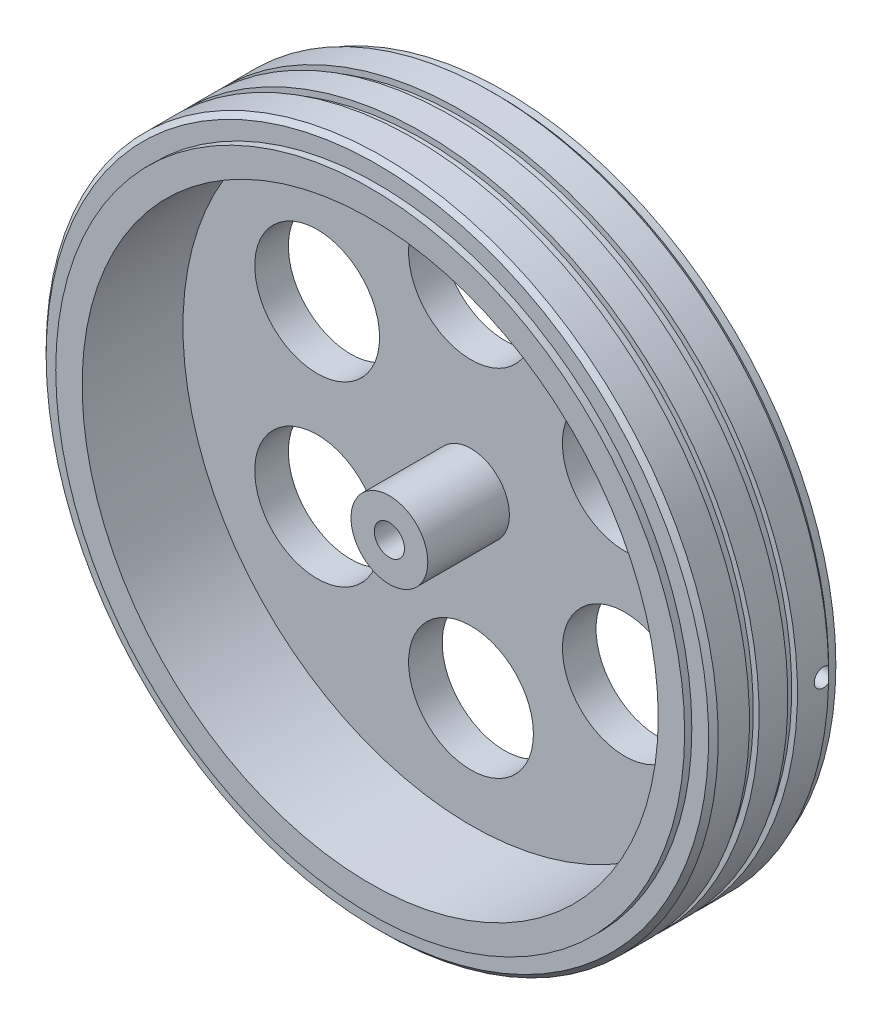
ISO-10303-21;
HEADER;
FILE_DESCRIPTION(('STEP AP214'),'2;1');
FILE_NAME('part.step','',(''),(''),'','','');
FILE_SCHEMA(('AUTOMOTIVE_DESIGN { 1 0 10303 214 1 1 1 1 }'));
ENDSEC;
DATA;
#1=APPLICATION_CONTEXT('core data for automotive mechanical design processes');
#2=APPLICATION_PROTOCOL_DEFINITION('international standard','automotive_design',2000,#1);
#3=PRODUCT_CONTEXT('',#1,'mechanical');
#4=PRODUCT('Part','Part','',(#3));
#5=PRODUCT_RELATED_PRODUCT_CATEGORY('part','',(#4));
#6=PRODUCT_DEFINITION_FORMATION('','',#4);
#7=PRODUCT_DEFINITION_CONTEXT('part definition',#1,'design');
#8=PRODUCT_DEFINITION('design','',#6,#7);
#9=PRODUCT_DEFINITION_SHAPE('','',#8);
#10=(LENGTH_UNIT() NAMED_UNIT(*) SI_UNIT(.MILLI.,.METRE.));
#11=(NAMED_UNIT(*) PLANE_ANGLE_UNIT() SI_UNIT($,.RADIAN.));
#12=(NAMED_UNIT(*) SI_UNIT($,.STERADIAN.) SOLID_ANGLE_UNIT());
#13=UNCERTAINTY_MEASURE_WITH_UNIT(LENGTH_MEASURE(1.E-05),#10,'distance_accuracy_value','');
#14=(GEOMETRIC_REPRESENTATION_CONTEXT(3) GLOBAL_UNCERTAINTY_ASSIGNED_CONTEXT((#13)) GLOBAL_UNIT_ASSIGNED_CONTEXT((#10,
#11,#12)) REPRESENTATION_CONTEXT('',''));
#15=CARTESIAN_POINT('',(0.,0.,0.));
#16=DIRECTION('',(0.,0.,1.));
#17=DIRECTION('',(1.,0.,0.));
#18=AXIS2_PLACEMENT_3D('',#15,#16,#17);
#19=CARTESIAN_POINT('',(0.,0.,0.));
#20=DIRECTION('',(0.,0.,-1.));
#21=DIRECTION('',(-1.,0.,0.));
#22=AXIS2_PLACEMENT_3D('',#19,#20,#21);
#23=CYLINDRICAL_SURFACE('',#22,70.);
#24=CARTESIAN_POINT('',(0.,0.,9.));
#25=DIRECTION('',(0.,0.,-1.));
#26=DIRECTION('',(-1.,0.,0.));
#27=AXIS2_PLACEMENT_3D('',#24,#25,#26);
#28=CIRCLE('',#27,70.);
#29=CARTESIAN_POINT('',(-70.,0.,9.));
#30=VERTEX_POINT('',#29);
#31=EDGE_CURVE('E72',#30,#30,#28,.T.);
#32=ORIENTED_EDGE('',*,*,#31,.T.);
#33=EDGE_LOOP('',(#32));
#34=FACE_BOUND('',#33,.T.);
#35=CARTESIAN_POINT('',(0.,0.,2.5));
#36=DIRECTION('',(0.,0.,-1.));
#37=DIRECTION('',(-1.,0.,0.));
#38=AXIS2_PLACEMENT_3D('',#35,#36,#37);
#39=CIRCLE('',#38,70.);
#40=CARTESIAN_POINT('',(69.9828550432176,-1.54919333848297,2.5));
#41=VERTEX_POINT('',#40);
#42=CARTESIAN_POINT('',(69.9828550432176,1.54919333848316,2.50000000000005));
#43=VERTEX_POINT('',#42);
#44=EDGE_CURVE('E67',#41,#43,#39,.T.);
#45=ORIENTED_EDGE('',*,*,#44,.F.);
#46=CARTESIAN_POINT('',(69.9828550432176,-1.54919333848297,2.5));
#47=CARTESIAN_POINT('',(69.9821699950699,-1.5801340021469,2.54357614975485));
#48=CARTESIAN_POINT('',(69.9815057230291,-1.60922088594838,2.58843752146515));
#49=CARTESIAN_POINT('',(69.9802362062229,-1.66351438197364,2.68044780927643));
#50=CARTESIAN_POINT('',(69.9796309587392,-1.6887211729357,2.72759661987382));
#51=CARTESIAN_POINT('',(69.9779316695055,-1.75819283756116,2.87190332629973));
#52=CARTESIAN_POINT('',(69.9769517970483,-1.79640824288858,2.97206155341133));
#53=CARTESIAN_POINT('',(69.9754104239647,-1.85548287890554,3.177371336838));
#54=CARTESIAN_POINT('',(69.9748491216351,-1.87633388378002,3.28252523478481));
#55=CARTESIAN_POINT('',(69.974208127022,-1.90008974999773,3.49483479849327));
#56=CARTESIAN_POINT('',(69.9741283376153,-1.90299823042355,3.60199005619832));
#57=CARTESIAN_POINT('',(69.9744593309165,-1.89078742296584,3.81524349461538));
#58=CARTESIAN_POINT('',(69.9748700195424,-1.87567159245446,3.92134187411889));
#59=CARTESIAN_POINT('',(69.9761355208292,-1.82784676701289,4.12951167444869));
#60=CARTESIAN_POINT('',(69.9769904017315,-1.79513506880407,4.23158247392508));
#61=CARTESIAN_POINT('',(69.9790479473008,-1.71304532050085,4.42878404038143));
#62=CARTESIAN_POINT('',(69.980250617261,-1.66366701675153,4.52391470171018));
#63=CARTESIAN_POINT('',(69.9828680766323,-1.54964988274148,4.70453162577262));
#64=CARTESIAN_POINT('',(69.9842828531443,-1.48501198033212,4.79001847442605));
#65=CARTESIAN_POINT('',(69.9871656976668,-1.34228188104707,4.94895955281252));
#66=CARTESIAN_POINT('',(69.9886337841544,-1.26418498348774,5.02240956101865));
#67=CARTESIAN_POINT('',(69.9914573418898,-1.09676574665419,5.15515851542349));
#68=CARTESIAN_POINT('',(69.9928128107317,-1.0074431676667,5.21445715935547));
#69=CARTESIAN_POINT('',(69.9952584140288,-0.820100202444896,5.31722188137198));
#70=CARTESIAN_POINT('',(69.9963485281451,-0.72207915027324,5.36068674595205));
#71=CARTESIAN_POINT('',(69.9981403678773,-0.520128056057234,5.43054163115542));
#72=CARTESIAN_POINT('',(69.998842096478,-0.416198059431255,5.4569317830021));
#73=CARTESIAN_POINT('',(69.9997779050191,-0.205410885079069,5.49188167208642));
#74=CARTESIAN_POINT('',(70.0000121199809,-0.0985545615381522,5.50044655742378));
#75=CARTESIAN_POINT('',(69.9999869047689,0.115079392891074,5.49951751213647));
#76=CARTESIAN_POINT('',(69.9997274752964,0.221857023890941,5.49002360716173));
#77=CARTESIAN_POINT('',(69.9987443254946,0.43227862075402,5.45325123699736));
#78=CARTESIAN_POINT('',(69.9980207050109,0.535923255492567,5.42597659634831));
#79=CARTESIAN_POINT('',(69.996190788202,0.737162914267488,5.3544216502671));
#80=CARTESIAN_POINT('',(69.9950844892186,0.834757896275256,5.31014122670646));
#81=CARTESIAN_POINT('',(69.9926135697291,1.02114947267244,5.20582135426022));
#82=CARTESIAN_POINT('',(69.9912488961611,1.10994425406724,5.14577866733212));
#83=CARTESIAN_POINT('',(69.9884151488781,1.27619359691991,5.0116435473827));
#84=CARTESIAN_POINT('',(69.9869460770559,1.35364836390028,4.93755136904536));
#85=CARTESIAN_POINT('',(69.9840686144789,1.49504365705181,4.77739470803601));
#86=CARTESIAN_POINT('',(69.9826602408072,1.55898039817505,4.69132688333819));
#87=CARTESIAN_POINT('',(69.9800633354694,1.67150085522027,4.50967058580225));
#88=CARTESIAN_POINT('',(69.978874816893,1.7200836571235,4.41408154661232));
#89=CARTESIAN_POINT('',(69.9768518452718,1.80050925670676,4.21610219511737));
#90=CARTESIAN_POINT('',(69.976017382932,1.83235249385168,4.11371206144143));
#91=CARTESIAN_POINT('',(69.9747967411601,1.87839217589012,3.90505163831947));
#92=CARTESIAN_POINT('',(69.9744104976447,1.89259114346007,3.79878190579321));
#93=CARTESIAN_POINT('',(69.9741297695507,1.90294268993806,3.58539985792459));
#94=CARTESIAN_POINT('',(69.974235119634,1.89910133635394,3.47828783796744));
#95=CARTESIAN_POINT('',(69.9749251900655,1.87350106196241,3.26622215540905));
#96=CARTESIAN_POINT('',(69.975509984633,1.85173936703058,3.16126882955886));
#97=CARTESIAN_POINT('',(69.9770732557186,1.79167187537866,2.95911883798243));
#98=CARTESIAN_POINT('',(69.9780411672215,1.75380818380465,2.86179180816243));
#99=CARTESIAN_POINT('',(69.9797083198211,1.68550734717637,2.72148731200217));
#100=CARTESIAN_POINT('',(69.9803003723284,1.66080308424496,2.67563892804158));
#101=CARTESIAN_POINT('',(69.9815400634534,1.60771673856627,2.58612007363377));
#102=CARTESIAN_POINT('',(69.9821877055623,1.57933442476797,2.54244974024811));
#103=CARTESIAN_POINT('',(69.9828550432176,1.54919333848297,2.5));
#104=B_SPLINE_CURVE_WITH_KNOTS('',3,(#46,#47,#48,#49,#50,#51,#52,#53,#54,#55,#56,#57,#58,#59,
#60,#61,#62,#63,#64,#65,#66,#67,#68,#69,#70,#71,#72,#73,#74,#75,#76,#77,#78,#79,#80,#81,#82,#83,
#84,#85,#86,#87,#88,#89,#90,#91,#92,#93,#94,#95,#96,#97,#98,#99,#100,#101,#102,#103),
.UNSPECIFIED.,.F.,.F.,(4,2,2,2,2,2,2,2,2,2,2,2,2,2,2,2,2,2,2,2,2,2,2,2,2,2,2,2,4),(0.,
0.160245183234278,0.320482982489432,0.640450132563806,0.960568770496787,1.2806228370434,
1.60061552160209,1.92065738114699,2.24070411174083,2.5607313870821,2.8808706623929,
3.20101677512147,3.52118741876195,3.84135560178301,4.16143130447087,4.48150655253749,
4.80151297684569,5.12152162407768,5.44159606221454,5.76166469871489,6.08182283611079,
6.40200002890597,6.72216881564835,7.0422918212256,7.36230716742662,7.68237206231039,
7.99416511898878,8.15026430628806,8.30637330431985),.UNSPECIFIED.);
#105=EDGE_CURVE('E56',#41,#43,#104,.T.);
#106=ORIENTED_EDGE('',*,*,#105,.T.);
#107=EDGE_LOOP('',(#45,#106));
#108=FACE_BOUND('',#107,.T.);
#109=ADVANCED_FACE('F39',(#34,#108),#23,.T.);
#110=CARTESIAN_POINT('',(0.,0.,1.5));
#111=DIRECTION('',(0.,0.,1.));
#112=DIRECTION('',(1.,0.,0.));
#113=AXIS2_PLACEMENT_3D('',#110,#111,#112);
#114=CONICAL_SURFACE('',#113,69.,0.785398163397449);
#115=CARTESIAN_POINT('',(0.,0.,1.5));
#116=DIRECTION('',(0.,0.,-1.));
#117=DIRECTION('',(-1.,0.,0.));
#118=AXIS2_PLACEMENT_3D('',#115,#116,#117);
#119=CIRCLE('',#118,69.);
#120=CARTESIAN_POINT('',(-69.,0.,1.5));
#121=VERTEX_POINT('',#120);
#122=EDGE_CURVE('E75',#121,#121,#119,.T.);
#123=ORIENTED_EDGE('',*,*,#122,.F.);
#124=EDGE_LOOP('',(#123));
#125=FACE_BOUND('',#124,.T.);
#126=ORIENTED_EDGE('',*,*,#44,.T.);
#127=CARTESIAN_POINT('',(70.0618614089016,1.60312443684265,2.58020000000102));
#128=CARTESIAN_POINT('',(70.0103649027091,1.56987694829996,2.52795768278689));
#129=CARTESIAN_POINT('',(69.9598062504573,1.53363280426329,2.47660395768639));
#130=CARTESIAN_POINT('',(69.861201852264,1.45489908200549,2.37633891333623));
#131=CARTESIAN_POINT('',(69.8131562332716,1.4124091886847,2.32742771747968));
#132=CARTESIAN_POINT('',(69.7195955303959,1.3203200822724,2.23208153927656));
#133=CARTESIAN_POINT('',(69.6741231658258,1.27063294777587,2.18568870226736));
#134=CARTESIAN_POINT('',(69.5873786071604,1.16450349569158,2.09710192732147));
#135=CARTESIAN_POINT('',(69.5460991302684,1.10807327492316,2.05490071171204));
#136=CARTESIAN_POINT('',(69.4635040507623,0.98029980280764,1.97038841345152));
#137=CARTESIAN_POINT('',(69.4229261922631,0.907971493403353,1.92882176586317));
#138=CARTESIAN_POINT('',(69.3504251031049,0.755243240447246,1.85449608158922));
#139=CARTESIAN_POINT('',(69.3184688813635,0.674875726471143,1.82170347474918));
#140=CARTESIAN_POINT('',(69.2647333883496,0.506293274289845,1.76653235786714));
#141=CARTESIAN_POINT('',(69.2430655125736,0.418004223547319,1.74426784938691));
#142=CARTESIAN_POINT('',(69.2122573715644,0.236971698828772,1.71260423842379));
#143=CARTESIAN_POINT('',(69.2031128745193,0.144229740518087,1.70320079002339));
#144=CARTESIAN_POINT('',(69.1985559448456,-0.0293814509111089,1.6985151406893));
#145=CARTESIAN_POINT('',(69.2014596726076,-0.110167164528784,1.70150137423387));
#146=CARTESIAN_POINT('',(69.2170580810763,-0.269747107360204,1.7175377496512));
#147=CARTESIAN_POINT('',(69.2297519061269,-0.348541509993335,1.73058701201355));
#148=CARTESIAN_POINT('',(69.2634681204126,-0.499412624720823,1.76522886023765));
#149=CARTESIAN_POINT('',(69.284197860143,-0.571625857577555,1.78652121894165));
#150=CARTESIAN_POINT('',(69.3328271705982,-0.710859331809432,1.83643646350474));
#151=CARTESIAN_POINT('',(69.3607277056006,-0.777878873194996,1.86506033525195));
#152=CARTESIAN_POINT('',(69.435710566198,-0.933370086353513,1.94192401178284));
#153=CARTESIAN_POINT('',(69.4858969836775,-1.01878640391222,1.99332142351219));
#154=CARTESIAN_POINT('',(69.5954279840924,-1.17704544821442,2.1053364854949));
#155=CARTESIAN_POINT('',(69.6548052137996,-1.24984131137193,2.16598699227539));
#156=CARTESIAN_POINT('',(69.7710652006879,-1.3732599368279,2.2845559145276));
#157=CARTESIAN_POINT('',(69.827075792026,-1.42556614085173,2.34160997749472));
#158=CARTESIAN_POINT('',(69.9422753512076,-1.52094851990721,2.45879583703623));
#159=CARTESIAN_POINT('',(70.0014325305823,-1.56410083099041,2.51889663971056));
#160=CARTESIAN_POINT('',(70.0618614089016,-1.60312443684265,2.58020000000102));
#161=B_SPLINE_CURVE_WITH_KNOTS('',3,(#127,#128,#129,#130,#131,#132,#133,#134,#135,#136,#137,
#138,#139,#140,#141,#142,#143,#144,#145,#146,#147,#148,#149,#150,#151,#152,#153,#154,#155,#156,
#157,#158,#159,#160),.UNSPECIFIED.,.F.,.F.,(4,2,2,2,2,2,2,2,2,2,2,2,2,2,2,2,4),(0.,
0.241641699802038,0.483295594676179,0.728199231480255,0.972669937226258,1.24993009215615,
1.52611374621404,1.80522314603028,2.08423820787166,2.32566872488897,2.56707814322931,
2.80041620748989,3.03378566583141,3.36677653670548,3.70097858544183,3.98705270999943,
4.27064507669392),.UNSPECIFIED.);
#162=EDGE_CURVE('E11',#43,#41,#161,.T.);
#163=ORIENTED_EDGE('',*,*,#162,.T.);
#164=EDGE_LOOP('',(#126,#163));
#165=FACE_BOUND('',#164,.T.);
#166=ADVANCED_FACE('F66',(#125,#165),#114,.T.);
#167=CARTESIAN_POINT('',(9.,0.,3.6));
#168=DIRECTION('',(-1.,0.,0.));
#169=DIRECTION('',(0.,0.,1.));
#170=AXIS2_PLACEMENT_3D('',#167,#168,#169);
#171=CYLINDRICAL_SURFACE('',#170,1.3);
#172=CARTESIAN_POINT('',(3.15,0.,4.9));
#173=CARTESIAN_POINT('',(3.14999455244473,-0.069692697613533,4.89999272630519));
#174=CARTESIAN_POINT('',(3.14766021625491,-0.139497834863106,4.89436238526101));
#175=CARTESIAN_POINT('',(3.13854845740953,-0.277132276712566,4.87203965997554));
#176=CARTESIAN_POINT('',(3.1317593212441,-0.344955878583975,4.85531811110427));
#177=CARTESIAN_POINT('',(3.11446798400485,-0.476411584643678,4.81153323455392));
#178=CARTESIAN_POINT('',(3.10397827041878,-0.540056941881002,4.78450466308569));
#179=CARTESIAN_POINT('',(3.08030998752748,-0.661849351900572,4.72101507407814));
#180=CARTESIAN_POINT('',(3.06713226145513,-0.719998120618457,4.68455701362258));
#181=CARTESIAN_POINT('',(3.03868100499926,-0.832113661095373,4.60133811789954));
#182=CARTESIAN_POINT('',(3.02333969010903,-0.88577284856748,4.55418626236761));
#183=CARTESIAN_POINT('',(2.99258803158752,-0.984685291239007,4.45174461965722));
#184=CARTESIAN_POINT('',(2.9771776564409,-1.02993419767832,4.39645064871715));
#185=CARTESIAN_POINT('',(2.94720547499569,-1.1128885038634,4.27607180294733));
#186=CARTESIAN_POINT('',(2.93272003500382,-1.1501269006504,4.21064411294447));
#187=CARTESIAN_POINT('',(2.90730997830691,-1.21293243774455,4.07376843317941));
#188=CARTESIAN_POINT('',(2.89638356244053,-1.23850547776067,4.0023235083177));
#189=CARTESIAN_POINT('',(2.88006089914635,-1.27599047670857,3.85898069301792));
#190=CARTESIAN_POINT('',(2.874426590354,-1.28849371555285,3.78726556616925));
#191=CARTESIAN_POINT('',(2.86864015105848,-1.30132952127152,3.64255090130889));
#192=CARTESIAN_POINT('',(2.86848507854276,-1.30166861954198,3.56955207363371));
#193=CARTESIAN_POINT('',(2.87347276690692,-1.29061252733012,3.43018026574501));
#194=CARTESIAN_POINT('',(2.87821940794458,-1.28009473604467,3.36372068255662));
#195=CARTESIAN_POINT('',(2.89180738957152,-1.24909303221162,3.23361088987512));
#196=CARTESIAN_POINT('',(2.90064949702196,-1.22860725315834,3.16996120897182));
#197=CARTESIAN_POINT('',(2.92163063721902,-1.17785366692838,3.04568727874889));
#198=CARTESIAN_POINT('',(2.93383524673787,-1.14738873728791,2.9851551024315));
#199=CARTESIAN_POINT('',(2.96015031103677,-1.07768075438894,2.86982974518971));
#200=CARTESIAN_POINT('',(2.97426150834656,-1.03843427718825,2.81503881505643));
#201=CARTESIAN_POINT('',(3.00422093418092,-0.94846309656726,2.70797893711454));
#202=CARTESIAN_POINT('',(3.02011626905649,-0.89705726537591,2.65629397759053));
#203=CARTESIAN_POINT('',(3.05086578853972,-0.786147076179482,2.56208467994389));
#204=CARTESIAN_POINT('',(3.06571973784112,-0.726640896738218,2.51956240770441));
#205=CARTESIAN_POINT('',(3.09312944944474,-0.599473145849867,2.4440512144347));
#206=CARTESIAN_POINT('',(3.10562671077283,-0.531659552611123,2.41129551060971));
#207=CARTESIAN_POINT('',(3.12646761198327,-0.390837258748827,2.35786108819404));
#208=CARTESIAN_POINT('',(3.13481350225014,-0.317831397348979,2.33717582537648));
#209=CARTESIAN_POINT('',(3.1459933952581,-0.173580867803542,2.30968178124127));
#210=CARTESIAN_POINT('',(3.14913830223005,-0.102509680841121,2.30208901697536));
#211=CARTESIAN_POINT('',(3.15055112579746,0.0399547989841509,2.29866361336006));
#212=CARTESIAN_POINT('',(3.14882040907143,0.111347995983827,2.30282767847279));
#213=CARTESIAN_POINT('',(3.14087859367634,0.248787202955951,2.32223269072218));
#214=CARTESIAN_POINT('',(3.13488878218215,0.314924644811207,2.33692681774791));
#215=CARTESIAN_POINT('',(3.11926576607795,0.44372605721898,2.37621791649447));
#216=CARTESIAN_POINT('',(3.10963209911692,0.506389585826244,2.40081614492392));
#217=CARTESIAN_POINT('',(3.08727687211328,0.628653575638519,2.46002131175397));
#218=CARTESIAN_POINT('',(3.0744689055268,0.688099029960417,2.49491467625667));
#219=CARTESIAN_POINT('',(3.04713744696318,0.80050288785245,2.57340421869329));
#220=CARTESIAN_POINT('',(3.0326132459771,0.853458591850515,2.61700399858027));
#221=CARTESIAN_POINT('',(3.00215814733459,0.955283335763768,2.71524990436354));
#222=CARTESIAN_POINT('',(2.98620005295157,1.00360493350037,2.77045644717947));
#223=CARTESIAN_POINT('',(2.9555967629026,1.09044630839947,2.88845647008808));
#224=CARTESIAN_POINT('',(2.94095184509543,1.12896401428359,2.95125154929278));
#225=CARTESIAN_POINT('',(2.91455645478511,1.19547633236666,3.08385450404827));
#226=CARTESIAN_POINT('',(2.90284639053251,1.22332656010374,3.15374343461832));
#227=CARTESIAN_POINT('',(2.88421748450953,1.2666316099941,3.29785271253183));
#228=CARTESIAN_POINT('',(2.87729479365167,1.28209639173303,3.37206952803545));
#229=CARTESIAN_POINT('',(2.86960470970629,1.29921080769914,3.51666587845973));
#230=CARTESIAN_POINT('',(2.86841051938737,1.3018187771732,3.58690985476541));
#231=CARTESIAN_POINT('',(2.87118247976143,1.29569391847327,3.72679061386719));
#232=CARTESIAN_POINT('',(2.87514787359779,1.28696275363111,3.79642748421097));
#233=CARTESIAN_POINT('',(2.887405324443,1.25920727299354,3.92990651928881));
#234=CARTESIAN_POINT('',(2.8954955480299,1.24066170927177,3.99386851902532));
#235=CARTESIAN_POINT('',(2.91493664769153,1.19426697515959,4.11779057478751));
#236=CARTESIAN_POINT('',(2.92628843622577,1.16641520089622,4.17774950511656));
#237=CARTESIAN_POINT('',(2.95181105840642,1.10028946762557,4.29585377095957));
#238=CARTESIAN_POINT('',(2.9661093980048,1.06149417996329,4.3536791659792));
#239=CARTESIAN_POINT('',(2.99555031290326,0.975320364877655,4.4622993338792));
#240=CARTESIAN_POINT('',(3.01069317073627,0.92793895290349,4.51309173384283));
#241=CARTESIAN_POINT('',(3.04140631530162,0.821948308848032,4.60990551356312));
#242=CARTESIAN_POINT('',(3.05693082937164,0.762781314202861,4.65533360293075));
#243=CARTESIAN_POINT('',(3.08557476294106,0.637084766387388,4.73564219642614));
#244=CARTESIAN_POINT('',(3.09869308149899,0.570551865201818,4.77051787707461));
#245=CARTESIAN_POINT('',(3.12084832976941,0.433094489401693,4.82795987750108));
#246=CARTESIAN_POINT('',(3.12995119413508,0.362264526731846,4.85072642457413));
#247=CARTESIAN_POINT('',(3.14331936294031,0.217456737130756,4.88381957610576));
#248=CARTESIAN_POINT('',(3.14759986181876,0.143489563712609,4.89418525996516));
#249=CARTESIAN_POINT('',(3.14974769565337,0.0461929267079351,4.89938691694167));
#250=CARTESIAN_POINT('',(3.15000180582642,0.0231026412152468,4.9000024111789));
#251=CARTESIAN_POINT('',(3.15,0.,4.9));
#252=B_SPLINE_CURVE_WITH_KNOTS('',3,(#172,#173,#174,#175,#176,#177,#178,#179,#180,#181,#182,
#183,#184,#185,#186,#187,#188,#189,#190,#191,#192,#193,#194,#195,#196,#197,#198,#199,#200,#201,
#202,#203,#204,#205,#206,#207,#208,#209,#210,#211,#212,#213,#214,#215,#216,#217,#218,#219,#220,
#221,#222,#223,#224,#225,#226,#227,#228,#229,#230,#231,#232,#233,#234,#235,#236,#237,#238,#239,
#240,#241,#242,#243,#244,#245,#246,#247,#248,#249,#250,#251),.UNSPECIFIED.,.T.,.F.,(4,2,2,2,2,2,
2,2,2,2,2,2,2,2,2,2,2,2,2,2,2,2,2,2,2,2,2,2,2,2,2,2,2,2,2,2,2,2,2,4),(0.,0.20901328480785,
0.418578366149569,0.627442936174266,0.836242085609332,1.05447359707122,1.27281763892647,
1.50165433614461,1.73037517142533,1.94823018406225,2.16596822019123,2.36739016109262,
2.56884983277486,2.77455673748443,2.98034398790625,3.20316208508201,3.42603036792918,
3.65385842504045,3.88156284564901,4.09508604360982,4.30854939517011,4.5116635595577,
4.71480350475978,4.9242358796631,5.1337550795437,5.35797507993969,5.58224241228072,
5.80944612804914,6.03646695711871,6.2462795651089,6.45606139927045,6.65644320570938,
6.85688112589053,7.06923977051562,7.28166989078703,7.50915600674821,7.73674594949242,
7.96044543038989,8.18343808424227,8.25272452447899),.UNSPECIFIED.);
#253=CARTESIAN_POINT('',(3.15,0.,4.9));
#254=VERTEX_POINT('',#253);
#255=EDGE_CURVE('E70',#254,#254,#252,.T.);
#256=ORIENTED_EDGE('',*,*,#255,.F.);
#257=EDGE_LOOP('',(#256));
#258=FACE_BOUND('',#257,.T.);
#259=CARTESIAN_POINT('',(8.5,0.,3.6));
#260=DIRECTION('',(1.,0.,0.));
#261=DIRECTION('',(0.,0.,-1.));
#262=AXIS2_PLACEMENT_3D('',#259,#260,#261);
#263=CIRCLE('',#262,1.3);
#264=CARTESIAN_POINT('',(8.5,0.,2.3));
#265=VERTEX_POINT('',#264);
#266=EDGE_CURVE('E68',#265,#265,#263,.T.);
#267=ORIENTED_EDGE('',*,*,#266,.T.);
#268=EDGE_LOOP('',(#267));
#269=FACE_BOUND('',#268,.T.);
#270=ADVANCED_FACE('F180',(#258,#269),#171,.F.);
#271=CARTESIAN_POINT('',(0.,0.,29.));
#272=DIRECTION('',(0.,0.,-1.));
#273=DIRECTION('',(-1.,0.,0.));
#274=AXIS2_PLACEMENT_3D('',#271,#272,#273);
#275=CYLINDRICAL_SURFACE('',#274,3.15);
#276=CARTESIAN_POINT('',(0.,0.,0.));
#277=DIRECTION('',(0.,0.,1.));
#278=DIRECTION('',(1.,0.,0.));
#279=AXIS2_PLACEMENT_3D('',#276,#277,#278);
#280=CIRCLE('',#279,3.15);
#281=CARTESIAN_POINT('',(3.15,0.,0.));
#282=VERTEX_POINT('',#281);
#283=EDGE_CURVE('E115',#282,#282,#280,.F.);
#284=ORIENTED_EDGE('',*,*,#283,.T.);
#285=EDGE_LOOP('',(#284));
#286=FACE_BOUND('',#285,.T.);
#287=CARTESIAN_POINT('',(0.,0.,24.));
#288=DIRECTION('',(0.,0.,1.));
#289=DIRECTION('',(1.,0.,0.));
#290=AXIS2_PLACEMENT_3D('',#287,#288,#289);
#291=CIRCLE('',#290,3.15);
#292=CARTESIAN_POINT('',(3.15,0.,24.));
#293=VERTEX_POINT('',#292);
#294=EDGE_CURVE('E112',#293,#293,#291,.F.);
#295=ORIENTED_EDGE('',*,*,#294,.F.);
#296=EDGE_LOOP('',(#295));
#297=FACE_BOUND('',#296,.T.);
#298=ORIENTED_EDGE('',*,*,#255,.T.);
#299=EDGE_LOOP('',(#298));
#300=FACE_BOUND('',#299,.T.);
#301=ADVANCED_FACE('F171',(#286,#297,#300),#275,.F.);
#302=CARTESIAN_POINT('',(0.,0.,28.));
#303=DIRECTION('',(0.,0.,1.));
#304=DIRECTION('',(1.,0.,0.));
#305=AXIS2_PLACEMENT_3D('',#302,#303,#304);
#306=PLANE('',#305);
#307=CARTESIAN_POINT('',(0.,0.,28.));
#308=DIRECTION('',(0.,0.,1.));
#309=DIRECTION('',(1.,0.,0.));
#310=AXIS2_PLACEMENT_3D('',#307,#308,#309);
#311=CIRCLE('',#310,65.5);
#312=CARTESIAN_POINT('',(65.5,0.,28.));
#313=VERTEX_POINT('',#312);
#314=EDGE_CURVE('E141',#313,#313,#311,.T.);
#315=ORIENTED_EDGE('',*,*,#314,.T.);
#316=EDGE_LOOP('',(#315));
#317=FACE_BOUND('',#316,.T.);
#318=CARTESIAN_POINT('',(0.,0.,28.));
#319=DIRECTION('',(0.,0.,1.));
#320=DIRECTION('',(1.,0.,0.));
#321=AXIS2_PLACEMENT_3D('',#318,#319,#320);
#322=CIRCLE('',#321,60.);
#323=CARTESIAN_POINT('',(60.,0.,28.));
#324=VERTEX_POINT('',#323);
#325=EDGE_CURVE('E148',#324,#324,#322,.T.);
#326=ORIENTED_EDGE('',*,*,#325,.F.);
#327=EDGE_LOOP('',(#326));
#328=FACE_BOUND('',#327,.T.);
#329=ADVANCED_FACE('F209',(#317,#328),#306,.T.);
#330=CARTESIAN_POINT('',(0.,0.,0.));
#331=DIRECTION('',(0.,0.,1.));
#332=DIRECTION('',(1.,0.,0.));
#333=AXIS2_PLACEMENT_3D('',#330,#331,#332);
#334=PLANE('',#333);
#335=CARTESIAN_POINT('',(0.,0.,0.));
#336=DIRECTION('',(0.,0.,1.));
#337=DIRECTION('',(1.,0.,0.));
#338=AXIS2_PLACEMENT_3D('',#335,#336,#337);
#339=CIRCLE('',#338,69.);
#340=CARTESIAN_POINT('',(69.,0.,0.));
#341=VERTEX_POINT('',#340);
#342=EDGE_CURVE('E76',#341,#341,#339,.T.);
#343=ORIENTED_EDGE('',*,*,#342,.F.);
#344=EDGE_LOOP('',(#343));
#345=FACE_BOUND('',#344,.T.);
#346=CARTESIAN_POINT('',(32.0429399400242,18.5,0.));
#347=DIRECTION('',(0.,0.,1.));
#348=DIRECTION('',(1.,0.,0.));
#349=AXIS2_PLACEMENT_3D('',#346,#347,#348);
#350=CIRCLE('',#349,13.);
#351=CARTESIAN_POINT('',(45.0429399400242,18.5,0.));
#352=VERTEX_POINT('',#351);
#353=EDGE_CURVE('E118',#352,#352,#350,.F.);
#354=ORIENTED_EDGE('',*,*,#353,.F.);
#355=EDGE_LOOP('',(#354));
#356=FACE_BOUND('',#355,.T.);
#357=CARTESIAN_POINT('',(0.,37.,0.));
#358=DIRECTION('',(0.,0.,1.));
#359=DIRECTION('',(1.,0.,0.));
#360=AXIS2_PLACEMENT_3D('',#357,#358,#359);
#361=CIRCLE('',#360,13.);
#362=CARTESIAN_POINT('',(13.,37.,0.));
#363=VERTEX_POINT('',#362);
#364=EDGE_CURVE('E117',#363,#363,#361,.F.);
#365=ORIENTED_EDGE('',*,*,#364,.F.);
#366=EDGE_LOOP('',(#365));
#367=FACE_BOUND('',#366,.T.);
#368=CARTESIAN_POINT('',(-32.0429399400242,18.5,0.));
#369=DIRECTION('',(0.,0.,1.));
#370=DIRECTION('',(1.,0.,0.));
#371=AXIS2_PLACEMENT_3D('',#368,#369,#370);
#372=CIRCLE('',#371,13.);
#373=CARTESIAN_POINT('',(-19.0429399400242,18.5,0.));
#374=VERTEX_POINT('',#373);
#375=EDGE_CURVE('E124',#374,#374,#372,.F.);
#376=ORIENTED_EDGE('',*,*,#375,.F.);
#377=EDGE_LOOP('',(#376));
#378=FACE_BOUND('',#377,.T.);
#379=CARTESIAN_POINT('',(-32.0429399400242,-18.5,0.));
#380=DIRECTION('',(0.,0.,1.));
#381=DIRECTION('',(1.,0.,0.));
#382=AXIS2_PLACEMENT_3D('',#379,#380,#381);
#383=CIRCLE('',#382,13.);
#384=CARTESIAN_POINT('',(-19.0429399400242,-18.5,0.));
#385=VERTEX_POINT('',#384);
#386=EDGE_CURVE('E126',#385,#385,#383,.F.);
#387=ORIENTED_EDGE('',*,*,#386,.F.);
#388=EDGE_LOOP('',(#387));
#389=FACE_BOUND('',#388,.T.);
#390=CARTESIAN_POINT('',(0.,-37.,0.));
#391=DIRECTION('',(0.,0.,1.));
#392=DIRECTION('',(1.,0.,0.));
#393=AXIS2_PLACEMENT_3D('',#390,#391,#392);
#394=CIRCLE('',#393,13.);
#395=CARTESIAN_POINT('',(13.,-37.,0.));
#396=VERTEX_POINT('',#395);
#397=EDGE_CURVE('E135',#396,#396,#394,.F.);
#398=ORIENTED_EDGE('',*,*,#397,.F.);
#399=EDGE_LOOP('',(#398));
#400=FACE_BOUND('',#399,.T.);
#401=CARTESIAN_POINT('',(32.0429399400242,-18.5,0.));
#402=DIRECTION('',(0.,0.,1.));
#403=DIRECTION('',(1.,0.,0.));
#404=AXIS2_PLACEMENT_3D('',#401,#402,#403);
#405=CIRCLE('',#404,13.);
#406=CARTESIAN_POINT('',(45.0429399400242,-18.5,0.));
#407=VERTEX_POINT('',#406);
#408=EDGE_CURVE('E137',#407,#407,#405,.F.);
#409=ORIENTED_EDGE('',*,*,#408,.F.);
#410=EDGE_LOOP('',(#409));
#411=FACE_BOUND('',#410,.T.);
#412=ORIENTED_EDGE('',*,*,#283,.F.);
#413=EDGE_LOOP('',(#412));
#414=FACE_BOUND('',#413,.T.);
#415=ADVANCED_FACE('F41',(#345,#356,#367,#378,#389,#400,#411,#414),#334,.F.);
#416=CARTESIAN_POINT('',(0.,0.,28.));
#417=DIRECTION('',(0.,0.,-1.));
#418=DIRECTION('',(-1.,0.,0.));
#419=AXIS2_PLACEMENT_3D('',#416,#417,#418);
#420=CYLINDRICAL_SURFACE('',#419,60.);
#421=CARTESIAN_POINT('',(0.,0.,7.));
#422=DIRECTION('',(0.,0.,1.));
#423=DIRECTION('',(1.,0.,0.));
#424=AXIS2_PLACEMENT_3D('',#421,#422,#423);
#425=CIRCLE('',#424,60.);
#426=CARTESIAN_POINT('',(60.,0.,7.));
#427=VERTEX_POINT('',#426);
#428=EDGE_CURVE('E52',#427,#427,#425,.T.);
#429=ORIENTED_EDGE('',*,*,#428,.F.);
#430=EDGE_LOOP('',(#429));
#431=FACE_BOUND('',#430,.T.);
#432=ORIENTED_EDGE('',*,*,#325,.T.);
#433=EDGE_LOOP('',(#432));
#434=FACE_BOUND('',#433,.T.);
#435=ADVANCED_FACE('F207',(#431,#434),#420,.F.);
#436=CARTESIAN_POINT('',(0.,0.,28.));
#437=DIRECTION('',(0.,0.,-1.));
#438=DIRECTION('',(-1.,0.,0.));
#439=AXIS2_PLACEMENT_3D('',#436,#437,#438);
#440=CYLINDRICAL_SURFACE('',#439,65.5);
#441=ORIENTED_EDGE('',*,*,#314,.F.);
#442=EDGE_LOOP('',(#441));
#443=FACE_BOUND('',#442,.T.);
#444=CARTESIAN_POINT('',(0.,0.,26.5));
#445=DIRECTION('',(0.,0.,1.));
#446=DIRECTION('',(1.,0.,0.));
#447=AXIS2_PLACEMENT_3D('',#444,#445,#446);
#448=CIRCLE('',#447,65.5);
#449=CARTESIAN_POINT('',(65.5,0.,26.5));
#450=VERTEX_POINT('',#449);
#451=EDGE_CURVE('E107',#450,#450,#448,.T.);
#452=ORIENTED_EDGE('',*,*,#451,.T.);
#453=EDGE_LOOP('',(#452));
#454=FACE_BOUND('',#453,.T.);
#455=ADVANCED_FACE('F469',(#443,#454),#440,.T.);
#456=CARTESIAN_POINT('',(0.,0.,7.));
#457=DIRECTION('',(0.,0.,1.));
#458=DIRECTION('',(1.,0.,0.));
#459=AXIS2_PLACEMENT_3D('',#456,#457,#458);
#460=PLANE('',#459);
#461=CARTESIAN_POINT('',(32.0429399400242,-18.5,7.));
#462=DIRECTION('',(0.,0.,1.));
#463=DIRECTION('',(1.,0.,0.));
#464=AXIS2_PLACEMENT_3D('',#461,#462,#463);
#465=CIRCLE('',#464,13.);
#466=CARTESIAN_POINT('',(45.0429399400242,-18.5,7.));
#467=VERTEX_POINT('',#466);
#468=EDGE_CURVE('E132',#467,#467,#465,.F.);
#469=ORIENTED_EDGE('',*,*,#468,.T.);
#470=EDGE_LOOP('',(#469));
#471=FACE_BOUND('',#470,.T.);
#472=CARTESIAN_POINT('',(0.,-37.,7.));
#473=DIRECTION('',(0.,0.,1.));
#474=DIRECTION('',(1.,0.,0.));
#475=AXIS2_PLACEMENT_3D('',#472,#473,#474);
#476=CIRCLE('',#475,13.);
#477=CARTESIAN_POINT('',(13.,-37.,7.));
#478=VERTEX_POINT('',#477);
#479=EDGE_CURVE('E133',#478,#478,#476,.F.);
#480=ORIENTED_EDGE('',*,*,#479,.T.);
#481=EDGE_LOOP('',(#480));
#482=FACE_BOUND('',#481,.T.);
#483=CARTESIAN_POINT('',(-32.0429399400242,-18.5,7.));
#484=DIRECTION('',(0.,0.,1.));
#485=DIRECTION('',(1.,0.,0.));
#486=AXIS2_PLACEMENT_3D('',#483,#484,#485);
#487=CIRCLE('',#486,13.);
#488=CARTESIAN_POINT('',(-19.0429399400242,-18.5,7.));
#489=VERTEX_POINT('',#488);
#490=EDGE_CURVE('E130',#489,#489,#487,.F.);
#491=ORIENTED_EDGE('',*,*,#490,.T.);
#492=EDGE_LOOP('',(#491));
#493=FACE_BOUND('',#492,.T.);
#494=CARTESIAN_POINT('',(-32.0429399400242,18.5,7.));
#495=DIRECTION('',(0.,0.,1.));
#496=DIRECTION('',(1.,0.,0.));
#497=AXIS2_PLACEMENT_3D('',#494,#495,#496);
#498=CIRCLE('',#497,13.);
#499=CARTESIAN_POINT('',(-19.0429399400242,18.5,7.));
#500=VERTEX_POINT('',#499);
#501=EDGE_CURVE('E123',#500,#500,#498,.F.);
#502=ORIENTED_EDGE('',*,*,#501,.T.);
#503=EDGE_LOOP('',(#502));
#504=FACE_BOUND('',#503,.T.);
#505=CARTESIAN_POINT('',(0.,37.,7.));
#506=DIRECTION('',(0.,0.,1.));
#507=DIRECTION('',(1.,0.,0.));
#508=AXIS2_PLACEMENT_3D('',#505,#506,#507);
#509=CIRCLE('',#508,13.);
#510=CARTESIAN_POINT('',(13.,37.,7.));
#511=VERTEX_POINT('',#510);
#512=EDGE_CURVE('E119',#511,#511,#509,.F.);
#513=ORIENTED_EDGE('',*,*,#512,.T.);
#514=EDGE_LOOP('',(#513));
#515=FACE_BOUND('',#514,.T.);
#516=CARTESIAN_POINT('',(32.0429399400242,18.5,7.));
#517=DIRECTION('',(0.,0.,1.));
#518=DIRECTION('',(1.,0.,0.));
#519=AXIS2_PLACEMENT_3D('',#516,#517,#518);
#520=CIRCLE('',#519,13.);
#521=CARTESIAN_POINT('',(45.0429399400242,18.5,7.));
#522=VERTEX_POINT('',#521);
#523=EDGE_CURVE('E113',#522,#522,#520,.F.);
#524=ORIENTED_EDGE('',*,*,#523,.T.);
#525=EDGE_LOOP('',(#524));
#526=FACE_BOUND('',#525,.T.);
#527=CARTESIAN_POINT('',(0.,0.,7.));
#528=DIRECTION('',(0.,0.,1.));
#529=DIRECTION('',(1.,0.,0.));
#530=AXIS2_PLACEMENT_3D('',#527,#528,#529);
#531=CIRCLE('',#530,8.);
#532=CARTESIAN_POINT('',(8.,0.,7.));
#533=VERTEX_POINT('',#532);
#534=EDGE_CURVE('E142',#533,#533,#531,.F.);
#535=ORIENTED_EDGE('',*,*,#534,.T.);
#536=EDGE_LOOP('',(#535));
#537=FACE_BOUND('',#536,.T.);
#538=ORIENTED_EDGE('',*,*,#428,.T.);
#539=EDGE_LOOP('',(#538));
#540=FACE_BOUND('',#539,.T.);
#541=ADVANCED_FACE('F458',(#471,#482,#493,#504,#515,#526,#537,#540),#460,.T.);
#542=CARTESIAN_POINT('',(0.,0.,24.));
#543=DIRECTION('',(0.,0.,-1.));
#544=DIRECTION('',(-1.,0.,0.));
#545=AXIS2_PLACEMENT_3D('',#542,#543,#544);
#546=CYLINDRICAL_SURFACE('',#545,8.);
#547=ORIENTED_EDGE('',*,*,#534,.F.);
#548=EDGE_LOOP('',(#547));
#549=FACE_BOUND('',#548,.T.);
#550=CARTESIAN_POINT('',(0.,0.,24.));
#551=DIRECTION('',(0.,0.,1.));
#552=DIRECTION('',(1.,0.,0.));
#553=AXIS2_PLACEMENT_3D('',#550,#551,#552);
#554=CIRCLE('',#553,8.);
#555=CARTESIAN_POINT('',(8.,0.,24.));
#556=VERTEX_POINT('',#555);
#557=EDGE_CURVE('E139',#556,#556,#554,.T.);
#558=ORIENTED_EDGE('',*,*,#557,.F.);
#559=EDGE_LOOP('',(#558));
#560=FACE_BOUND('',#559,.T.);
#561=ADVANCED_FACE('F452',(#549,#560),#546,.T.);
#562=CARTESIAN_POINT('',(0.,0.,24.));
#563=DIRECTION('',(0.,0.,1.));
#564=DIRECTION('',(1.,0.,0.));
#565=AXIS2_PLACEMENT_3D('',#562,#563,#564);
#566=PLANE('',#565);
#567=ORIENTED_EDGE('',*,*,#294,.T.);
#568=EDGE_LOOP('',(#567));
#569=FACE_BOUND('',#568,.T.);
#570=ORIENTED_EDGE('',*,*,#557,.T.);
#571=EDGE_LOOP('',(#570));
#572=FACE_BOUND('',#571,.T.);
#573=ADVANCED_FACE('F442',(#569,#572),#566,.T.);
#574=CARTESIAN_POINT('',(32.0429399400242,18.5,8.));
#575=DIRECTION('',(0.,0.,-1.));
#576=DIRECTION('',(-1.,0.,0.));
#577=AXIS2_PLACEMENT_3D('',#574,#575,#576);
#578=CYLINDRICAL_SURFACE('',#577,13.);
#579=ORIENTED_EDGE('',*,*,#523,.F.);
#580=EDGE_LOOP('',(#579));
#581=FACE_BOUND('',#580,.T.);
#582=ORIENTED_EDGE('',*,*,#353,.T.);
#583=EDGE_LOOP('',(#582));
#584=FACE_BOUND('',#583,.T.);
#585=ADVANCED_FACE('F435',(#581,#584),#578,.F.);
#586=CARTESIAN_POINT('',(0.,37.,8.));
#587=DIRECTION('',(0.,0.,-1.));
#588=DIRECTION('',(-1.,0.,0.));
#589=AXIS2_PLACEMENT_3D('',#586,#587,#588);
#590=CYLINDRICAL_SURFACE('',#589,13.);
#591=ORIENTED_EDGE('',*,*,#512,.F.);
#592=EDGE_LOOP('',(#591));
#593=FACE_BOUND('',#592,.T.);
#594=ORIENTED_EDGE('',*,*,#364,.T.);
#595=EDGE_LOOP('',(#594));
#596=FACE_BOUND('',#595,.T.);
#597=ADVANCED_FACE('F425',(#593,#596),#590,.F.);
#598=CARTESIAN_POINT('',(-32.0429399400242,18.5,8.));
#599=DIRECTION('',(0.,0.,-1.));
#600=DIRECTION('',(-1.,0.,0.));
#601=AXIS2_PLACEMENT_3D('',#598,#599,#600);
#602=CYLINDRICAL_SURFACE('',#601,13.);
#603=ORIENTED_EDGE('',*,*,#501,.F.);
#604=EDGE_LOOP('',(#603));
#605=FACE_BOUND('',#604,.T.);
#606=ORIENTED_EDGE('',*,*,#375,.T.);
#607=EDGE_LOOP('',(#606));
#608=FACE_BOUND('',#607,.T.);
#609=ADVANCED_FACE('F415',(#605,#608),#602,.F.);
#610=CARTESIAN_POINT('',(-32.0429399400242,-18.5,8.));
#611=DIRECTION('',(0.,0.,-1.));
#612=DIRECTION('',(-1.,0.,0.));
#613=AXIS2_PLACEMENT_3D('',#610,#611,#612);
#614=CYLINDRICAL_SURFACE('',#613,13.);
#615=ORIENTED_EDGE('',*,*,#490,.F.);
#616=EDGE_LOOP('',(#615));
#617=FACE_BOUND('',#616,.T.);
#618=ORIENTED_EDGE('',*,*,#386,.T.);
#619=EDGE_LOOP('',(#618));
#620=FACE_BOUND('',#619,.T.);
#621=ADVANCED_FACE('F405',(#617,#620),#614,.F.);
#622=CARTESIAN_POINT('',(0.,-37.,8.));
#623=DIRECTION('',(0.,0.,-1.));
#624=DIRECTION('',(-1.,0.,0.));
#625=AXIS2_PLACEMENT_3D('',#622,#623,#624);
#626=CYLINDRICAL_SURFACE('',#625,13.);
#627=ORIENTED_EDGE('',*,*,#479,.F.);
#628=EDGE_LOOP('',(#627));
#629=FACE_BOUND('',#628,.T.);
#630=ORIENTED_EDGE('',*,*,#397,.T.);
#631=EDGE_LOOP('',(#630));
#632=FACE_BOUND('',#631,.T.);
#633=ADVANCED_FACE('F395',(#629,#632),#626,.F.);
#634=CARTESIAN_POINT('',(32.0429399400242,-18.5,8.));
#635=DIRECTION('',(0.,0.,-1.));
#636=DIRECTION('',(-1.,0.,0.));
#637=AXIS2_PLACEMENT_3D('',#634,#635,#636);
#638=CYLINDRICAL_SURFACE('',#637,13.);
#639=ORIENTED_EDGE('',*,*,#468,.F.);
#640=EDGE_LOOP('',(#639));
#641=FACE_BOUND('',#640,.T.);
#642=ORIENTED_EDGE('',*,*,#408,.T.);
#643=EDGE_LOOP('',(#642));
#644=FACE_BOUND('',#643,.T.);
#645=ADVANCED_FACE('F385',(#641,#644),#638,.F.);
#646=CARTESIAN_POINT('',(0.,64.,26.5));
#647=DIRECTION('',(0.,0.,1.));
#648=DIRECTION('',(1.,0.,0.));
#649=AXIS2_PLACEMENT_3D('',#646,#647,#648);
#650=PLANE('',#649);
#651=ORIENTED_EDGE('',*,*,#451,.F.);
#652=EDGE_LOOP('',(#651));
#653=FACE_BOUND('',#652,.T.);
#654=CARTESIAN_POINT('',(0.,0.,26.5));
#655=DIRECTION('',(0.,0.,-1.));
#656=DIRECTION('',(-1.,0.,0.));
#657=AXIS2_PLACEMENT_3D('',#654,#655,#656);
#658=CIRCLE('',#657,69.);
#659=CARTESIAN_POINT('',(-69.,0.,26.5));
#660=VERTEX_POINT('',#659);
#661=EDGE_CURVE('E104',#660,#660,#658,.T.);
#662=ORIENTED_EDGE('',*,*,#661,.F.);
#663=EDGE_LOOP('',(#662));
#664=FACE_BOUND('',#663,.T.);
#665=ADVANCED_FACE('F375',(#653,#664),#650,.T.);
#666=CARTESIAN_POINT('',(0.,0.,25.5));
#667=DIRECTION('',(0.,0.,-1.));
#668=DIRECTION('',(-1.,0.,0.));
#669=AXIS2_PLACEMENT_3D('',#666,#667,#668);
#670=CONICAL_SURFACE('',#669,70.,0.78539816339745);
#671=ORIENTED_EDGE('',*,*,#661,.T.);
#672=EDGE_LOOP('',(#671));
#673=FACE_BOUND('',#672,.T.);
#674=CARTESIAN_POINT('',(0.,0.,25.5));
#675=DIRECTION('',(0.,0.,-1.));
#676=DIRECTION('',(-1.,0.,0.));
#677=AXIS2_PLACEMENT_3D('',#674,#675,#676);
#678=CIRCLE('',#677,70.);
#679=CARTESIAN_POINT('',(-70.,0.,25.5));
#680=VERTEX_POINT('',#679);
#681=EDGE_CURVE('E105',#680,#680,#678,.T.);
#682=ORIENTED_EDGE('',*,*,#681,.F.);
#683=EDGE_LOOP('',(#682));
#684=FACE_BOUND('',#683,.T.);
#685=ADVANCED_FACE('F362',(#673,#684),#670,.T.);
#686=CARTESIAN_POINT('',(0.,0.,0.));
#687=DIRECTION('',(0.,0.,-1.));
#688=DIRECTION('',(-1.,0.,0.));
#689=AXIS2_PLACEMENT_3D('',#686,#687,#688);
#690=CYLINDRICAL_SURFACE('',#689,70.);
#691=ORIENTED_EDGE('',*,*,#681,.T.);
#692=EDGE_LOOP('',(#691));
#693=FACE_BOUND('',#692,.T.);
#694=CARTESIAN_POINT('',(0.,0.,19.));
#695=DIRECTION('',(0.,0.,-1.));
#696=DIRECTION('',(-1.,0.,0.));
#697=AXIS2_PLACEMENT_3D('',#694,#695,#696);
#698=CIRCLE('',#697,70.);
#699=CARTESIAN_POINT('',(-70.,0.,19.));
#700=VERTEX_POINT('',#699);
#701=EDGE_CURVE('E97',#700,#700,#698,.T.);
#702=ORIENTED_EDGE('',*,*,#701,.F.);
#703=EDGE_LOOP('',(#702));
#704=FACE_BOUND('',#703,.T.);
#705=ADVANCED_FACE('F355',(#693,#704),#690,.T.);
#706=CARTESIAN_POINT('',(0.,70.,19.));
#707=DIRECTION('',(0.,0.,-1.));
#708=DIRECTION('',(-1.,0.,0.));
#709=AXIS2_PLACEMENT_3D('',#706,#707,#708);
#710=PLANE('',#709);
#711=ORIENTED_EDGE('',*,*,#701,.T.);
#712=EDGE_LOOP('',(#711));
#713=FACE_BOUND('',#712,.T.);
#714=CARTESIAN_POINT('',(0.,0.,19.));
#715=DIRECTION('',(0.,0.,-1.));
#716=DIRECTION('',(-1.,0.,0.));
#717=AXIS2_PLACEMENT_3D('',#714,#715,#716);
#718=CIRCLE('',#717,68.8);
#719=CARTESIAN_POINT('',(-68.8,0.,19.));
#720=VERTEX_POINT('',#719);
#721=EDGE_CURVE('E96',#720,#720,#718,.T.);
#722=ORIENTED_EDGE('',*,*,#721,.F.);
#723=EDGE_LOOP('',(#722));
#724=FACE_BOUND('',#723,.T.);
#725=ADVANCED_FACE('F345',(#713,#724),#710,.T.);
#726=CARTESIAN_POINT('',(0.,0.,0.));
#727=DIRECTION('',(0.,0.,-1.));
#728=DIRECTION('',(-1.,0.,0.));
#729=AXIS2_PLACEMENT_3D('',#726,#727,#728);
#730=CYLINDRICAL_SURFACE('',#729,68.8);
#731=ORIENTED_EDGE('',*,*,#721,.T.);
#732=EDGE_LOOP('',(#731));
#733=FACE_BOUND('',#732,.T.);
#734=CARTESIAN_POINT('',(0.,0.,17.));
#735=DIRECTION('',(0.,0.,-1.));
#736=DIRECTION('',(-1.,0.,0.));
#737=AXIS2_PLACEMENT_3D('',#734,#735,#736);
#738=CIRCLE('',#737,68.8);
#739=CARTESIAN_POINT('',(-68.8,0.,17.));
#740=VERTEX_POINT('',#739);
#741=EDGE_CURVE('E91',#740,#740,#738,.T.);
#742=ORIENTED_EDGE('',*,*,#741,.F.);
#743=EDGE_LOOP('',(#742));
#744=FACE_BOUND('',#743,.T.);
#745=ADVANCED_FACE('F335',(#733,#744),#730,.T.);
#746=CARTESIAN_POINT('',(0.,68.8,17.));
#747=DIRECTION('',(0.,0.,1.));
#748=DIRECTION('',(1.,0.,0.));
#749=AXIS2_PLACEMENT_3D('',#746,#747,#748);
#750=PLANE('',#749);
#751=ORIENTED_EDGE('',*,*,#741,.T.);
#752=EDGE_LOOP('',(#751));
#753=FACE_BOUND('',#752,.T.);
#754=CARTESIAN_POINT('',(0.,0.,17.));
#755=DIRECTION('',(0.,0.,-1.));
#756=DIRECTION('',(-1.,0.,0.));
#757=AXIS2_PLACEMENT_3D('',#754,#755,#756);
#758=CIRCLE('',#757,70.);
#759=CARTESIAN_POINT('',(-70.,0.,17.));
#760=VERTEX_POINT('',#759);
#761=EDGE_CURVE('E89',#760,#760,#758,.T.);
#762=ORIENTED_EDGE('',*,*,#761,.F.);
#763=EDGE_LOOP('',(#762));
#764=FACE_BOUND('',#763,.T.);
#765=ADVANCED_FACE('F325',(#753,#764),#750,.T.);
#766=CARTESIAN_POINT('',(0.,0.,0.));
#767=DIRECTION('',(0.,0.,-1.));
#768=DIRECTION('',(-1.,0.,0.));
#769=AXIS2_PLACEMENT_3D('',#766,#767,#768);
#770=CYLINDRICAL_SURFACE('',#769,70.);
#771=ORIENTED_EDGE('',*,*,#761,.T.);
#772=EDGE_LOOP('',(#771));
#773=FACE_BOUND('',#772,.T.);
#774=CARTESIAN_POINT('',(0.,0.,11.));
#775=DIRECTION('',(0.,0.,-1.));
#776=DIRECTION('',(-1.,0.,0.));
#777=AXIS2_PLACEMENT_3D('',#774,#775,#776);
#778=CIRCLE('',#777,70.);
#779=CARTESIAN_POINT('',(-70.,0.,11.));
#780=VERTEX_POINT('',#779);
#781=EDGE_CURVE('E87',#780,#780,#778,.T.);
#782=ORIENTED_EDGE('',*,*,#781,.F.);
#783=EDGE_LOOP('',(#782));
#784=FACE_BOUND('',#783,.T.);
#785=ADVANCED_FACE('F315',(#773,#784),#770,.T.);
#786=CARTESIAN_POINT('',(0.,70.,11.));
#787=DIRECTION('',(0.,0.,-1.));
#788=DIRECTION('',(-1.,0.,0.));
#789=AXIS2_PLACEMENT_3D('',#786,#787,#788);
#790=PLANE('',#789);
#791=ORIENTED_EDGE('',*,*,#781,.T.);
#792=EDGE_LOOP('',(#791));
#793=FACE_BOUND('',#792,.T.);
#794=CARTESIAN_POINT('',(0.,0.,11.));
#795=DIRECTION('',(0.,0.,-1.));
#796=DIRECTION('',(-1.,0.,0.));
#797=AXIS2_PLACEMENT_3D('',#794,#795,#796);
#798=CIRCLE('',#797,68.8);
#799=CARTESIAN_POINT('',(-68.8,0.,11.));
#800=VERTEX_POINT('',#799);
#801=EDGE_CURVE('E84',#800,#800,#798,.T.);
#802=ORIENTED_EDGE('',*,*,#801,.F.);
#803=EDGE_LOOP('',(#802));
#804=FACE_BOUND('',#803,.T.);
#805=ADVANCED_FACE('F303',(#793,#804),#790,.T.);
#806=CARTESIAN_POINT('',(0.,0.,0.));
#807=DIRECTION('',(0.,0.,-1.));
#808=DIRECTION('',(-1.,0.,0.));
#809=AXIS2_PLACEMENT_3D('',#806,#807,#808);
#810=CYLINDRICAL_SURFACE('',#809,68.8);
#811=ORIENTED_EDGE('',*,*,#801,.T.);
#812=EDGE_LOOP('',(#811));
#813=FACE_BOUND('',#812,.T.);
#814=CARTESIAN_POINT('',(0.,0.,9.));
#815=DIRECTION('',(0.,0.,-1.));
#816=DIRECTION('',(-1.,0.,0.));
#817=AXIS2_PLACEMENT_3D('',#814,#815,#816);
#818=CIRCLE('',#817,68.8);
#819=CARTESIAN_POINT('',(-68.8,0.,9.));
#820=VERTEX_POINT('',#819);
#821=EDGE_CURVE('E73',#820,#820,#818,.T.);
#822=ORIENTED_EDGE('',*,*,#821,.F.);
#823=EDGE_LOOP('',(#822));
#824=FACE_BOUND('',#823,.T.);
#825=ADVANCED_FACE('F294',(#813,#824),#810,.T.);
#826=CARTESIAN_POINT('',(0.,68.8,9.));
#827=DIRECTION('',(0.,0.,1.));
#828=DIRECTION('',(1.,0.,0.));
#829=AXIS2_PLACEMENT_3D('',#826,#827,#828);
#830=PLANE('',#829);
#831=ORIENTED_EDGE('',*,*,#821,.T.);
#832=EDGE_LOOP('',(#831));
#833=FACE_BOUND('',#832,.T.);
#834=ORIENTED_EDGE('',*,*,#31,.F.);
#835=EDGE_LOOP('',(#834));
#836=FACE_BOUND('',#835,.T.);
#837=ADVANCED_FACE('F188',(#833,#836),#830,.T.);
#838=CARTESIAN_POINT('',(0.,0.,1.5));
#839=DIRECTION('',(0.,0.,-1.));
#840=DIRECTION('',(-1.,0.,0.));
#841=AXIS2_PLACEMENT_3D('',#838,#839,#840);
#842=CYLINDRICAL_SURFACE('',#841,69.);
#843=ORIENTED_EDGE('',*,*,#122,.T.);
#844=EDGE_LOOP('',(#843));
#845=FACE_BOUND('',#844,.T.);
#846=ORIENTED_EDGE('',*,*,#342,.T.);
#847=EDGE_LOOP('',(#846));
#848=FACE_BOUND('',#847,.T.);
#849=ADVANCED_FACE('F184',(#845,#848),#842,.T.);
#850=CARTESIAN_POINT('',(71.,0.,3.6));
#851=DIRECTION('',(-1.,0.,0.));
#852=DIRECTION('',(0.,0.,1.));
#853=AXIS2_PLACEMENT_3D('',#850,#851,#852);
#854=CYLINDRICAL_SURFACE('',#853,1.9);
#855=ORIENTED_EDGE('',*,*,#162,.F.);
#856=ORIENTED_EDGE('',*,*,#105,.F.);
#857=EDGE_LOOP('',(#855,#856));
#858=FACE_BOUND('',#857,.T.);
#859=CARTESIAN_POINT('',(8.5,0.,3.6));
#860=DIRECTION('',(1.,0.,0.));
#861=DIRECTION('',(0.,0.,-1.));
#862=AXIS2_PLACEMENT_3D('',#859,#860,#861);
#863=CIRCLE('',#862,1.9);
#864=CARTESIAN_POINT('',(8.5,0.,1.7));
#865=VERTEX_POINT('',#864);
#866=EDGE_CURVE('E205',#865,#865,#863,.T.);
#867=ORIENTED_EDGE('',*,*,#866,.F.);
#868=EDGE_LOOP('',(#867));
#869=FACE_BOUND('',#868,.T.);
#870=ADVANCED_FACE('F58',(#858,#869),#854,.F.);
#871=CARTESIAN_POINT('',(8.5,0.,3.6));
#872=DIRECTION('',(1.,0.,0.));
#873=DIRECTION('',(0.,0.,-1.));
#874=AXIS2_PLACEMENT_3D('',#871,#872,#873);
#875=PLANE('',#874);
#876=ORIENTED_EDGE('',*,*,#266,.F.);
#877=EDGE_LOOP('',(#876));
#878=FACE_BOUND('',#877,.T.);
#879=ORIENTED_EDGE('',*,*,#866,.T.);
#880=EDGE_LOOP('',(#879));
#881=FACE_BOUND('',#880,.T.);
#882=ADVANCED_FACE('F240',(#878,#881),#875,.T.);
#883=CLOSED_SHELL('',(#109,#166,#270,#301,#329,#415,#435,#455,#541,#561,#573,#585,#597,#609,
#621,#633,#645,#665,#685,#705,#725,#745,#765,#785,#805,#825,#837,#849,#870,#882));
#884=MANIFOLD_SOLID_BREP('B2',#883);
#885=ADVANCED_BREP_SHAPE_REPRESENTATION('',(#18,#884),#14);
#886=SHAPE_DEFINITION_REPRESENTATION(#9,#885);
ENDSEC;
END-ISO-10303-21;
